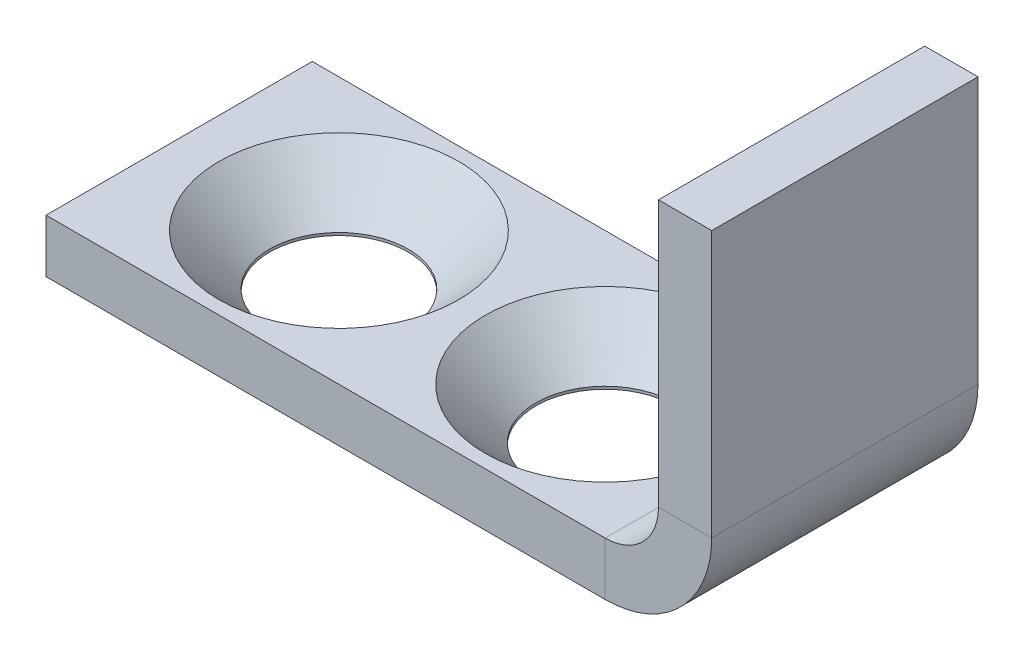
ISO-10303-21;
HEADER;
FILE_DESCRIPTION(('STEP AP214'),'2;1');
FILE_NAME('part.step','',(''),(''),'','','');
FILE_SCHEMA(('AUTOMOTIVE_DESIGN { 1 0 10303 214 1 1 1 1 }'));
ENDSEC;
DATA;
#1=APPLICATION_CONTEXT('core data for automotive mechanical design processes');
#2=APPLICATION_PROTOCOL_DEFINITION('international standard','automotive_design',2000,#1);
#3=PRODUCT_CONTEXT('',#1,'mechanical');
#4=PRODUCT('Part','Part','',(#3));
#5=PRODUCT_RELATED_PRODUCT_CATEGORY('part','',(#4));
#6=PRODUCT_DEFINITION_FORMATION('','',#4);
#7=PRODUCT_DEFINITION_CONTEXT('part definition',#1,'design');
#8=PRODUCT_DEFINITION('design','',#6,#7);
#9=PRODUCT_DEFINITION_SHAPE('','',#8);
#10=(LENGTH_UNIT() NAMED_UNIT(*) SI_UNIT(.MILLI.,.METRE.));
#11=(NAMED_UNIT(*) PLANE_ANGLE_UNIT() SI_UNIT($,.RADIAN.));
#12=(NAMED_UNIT(*) SI_UNIT($,.STERADIAN.) SOLID_ANGLE_UNIT());
#13=UNCERTAINTY_MEASURE_WITH_UNIT(LENGTH_MEASURE(1.E-05),#10,'distance_accuracy_value','');
#14=(GEOMETRIC_REPRESENTATION_CONTEXT(3) GLOBAL_UNCERTAINTY_ASSIGNED_CONTEXT((#13)) GLOBAL_UNIT_ASSIGNED_CONTEXT((#10,
#11,#12)) REPRESENTATION_CONTEXT('',''));
#15=CARTESIAN_POINT('',(0.,0.,0.));
#16=DIRECTION('',(0.,0.,1.));
#17=DIRECTION('',(1.,0.,0.));
#18=AXIS2_PLACEMENT_3D('',#15,#16,#17);
#19=CARTESIAN_POINT('',(0.,1.,5.));
#20=DIRECTION('',(0.,0.,1.));
#21=DIRECTION('',(1.,0.,0.));
#22=AXIS2_PLACEMENT_3D('',#19,#20,#21);
#23=PLANE('',#22);
#24=DIRECTION('',(1.,0.,0.));
#25=VECTOR('',#24,1.);
#26=CARTESIAN_POINT('',(0.,1.,5.));
#27=LINE('',#26,#25);
#28=CARTESIAN_POINT('',(0.,1.,5.));
#29=VERTEX_POINT('',#28);
#30=CARTESIAN_POINT('',(1.,1.,5.));
#31=VERTEX_POINT('',#30);
#32=EDGE_CURVE('E11',#29,#31,#27,.T.);
#33=ORIENTED_EDGE('',*,*,#32,.F.);
#34=CARTESIAN_POINT('',(-1.,1.,5.));
#35=DIRECTION('',(0.,0.,-1.));
#36=DIRECTION('',(-1.,0.,0.));
#37=AXIS2_PLACEMENT_3D('',#34,#35,#36);
#38=CIRCLE('',#37,1.);
#39=CARTESIAN_POINT('',(-1.,0.,5.));
#40=VERTEX_POINT('',#39);
#41=EDGE_CURVE('E144',#40,#29,#38,.F.);
#42=ORIENTED_EDGE('',*,*,#41,.F.);
#43=DIRECTION('',(0.,1.,0.));
#44=VECTOR('',#43,1.);
#45=CARTESIAN_POINT('',(-1.,-1.,5.));
#46=LINE('',#45,#44);
#47=CARTESIAN_POINT('',(-1.,-1.,5.));
#48=VERTEX_POINT('',#47);
#49=EDGE_CURVE('E51',#48,#40,#46,.T.);
#50=ORIENTED_EDGE('',*,*,#49,.F.);
#51=CARTESIAN_POINT('',(-1.,1.,5.));
#52=DIRECTION('',(0.,0.,1.));
#53=DIRECTION('',(1.,0.,0.));
#54=AXIS2_PLACEMENT_3D('',#51,#52,#53);
#55=CIRCLE('',#54,2.);
#56=EDGE_CURVE('E135',#48,#31,#55,.T.);
#57=ORIENTED_EDGE('',*,*,#56,.T.);
#58=EDGE_LOOP('',(#33,#42,#50,#57));
#59=FACE_BOUND('',#58,.T.);
#60=ADVANCED_FACE('F42',(#59),#23,.T.);
#61=CARTESIAN_POINT('',(-1.,-1.,5.));
#62=DIRECTION('',(0.,0.,1.));
#63=DIRECTION('',(1.,0.,0.));
#64=AXIS2_PLACEMENT_3D('',#61,#62,#63);
#65=PLANE('',#64);
#66=DIRECTION('',(0.,1.,0.));
#67=VECTOR('',#66,1.);
#68=CARTESIAN_POINT('',(0.,0.,5.));
#69=LINE('',#68,#67);
#70=CARTESIAN_POINT('',(0.,6.,5.));
#71=VERTEX_POINT('',#70);
#72=EDGE_CURVE('E214',#29,#71,#69,.T.);
#73=ORIENTED_EDGE('',*,*,#72,.F.);
#74=ORIENTED_EDGE('',*,*,#32,.T.);
#75=DIRECTION('',(0.,1.,0.));
#76=VECTOR('',#75,1.);
#77=CARTESIAN_POINT('',(1.,0.,5.));
#78=LINE('',#77,#76);
#79=CARTESIAN_POINT('',(1.,6.,5.));
#80=VERTEX_POINT('',#79);
#81=EDGE_CURVE('E99',#31,#80,#78,.T.);
#82=ORIENTED_EDGE('',*,*,#81,.T.);
#83=DIRECTION('',(1.,0.,0.));
#84=VECTOR('',#83,1.);
#85=CARTESIAN_POINT('',(0.,6.,5.));
#86=LINE('',#85,#84);
#87=EDGE_CURVE('E422',#71,#80,#86,.T.);
#88=ORIENTED_EDGE('',*,*,#87,.F.);
#89=EDGE_LOOP('',(#73,#74,#82,#88));
#90=FACE_BOUND('',#89,.T.);
#91=ADVANCED_FACE('F222',(#90),#65,.T.);
#92=CARTESIAN_POINT('',(-1.,0.,0.));
#93=DIRECTION('',(0.,0.,-1.));
#94=DIRECTION('',(-1.,0.,0.));
#95=AXIS2_PLACEMENT_3D('',#92,#93,#94);
#96=PLANE('',#95);
#97=DIRECTION('',(0.,-1.,0.));
#98=VECTOR('',#97,1.);
#99=CARTESIAN_POINT('',(-1.,0.,0.));
#100=LINE('',#99,#98);
#101=CARTESIAN_POINT('',(-1.,0.,0.));
#102=VERTEX_POINT('',#101);
#103=CARTESIAN_POINT('',(-1.,-1.,0.));
#104=VERTEX_POINT('',#103);
#105=EDGE_CURVE('E86',#102,#104,#100,.T.);
#106=ORIENTED_EDGE('',*,*,#105,.F.);
#107=CARTESIAN_POINT('',(-1.,1.,0.));
#108=DIRECTION('',(0.,0.,-1.));
#109=DIRECTION('',(-1.,0.,0.));
#110=AXIS2_PLACEMENT_3D('',#107,#108,#109);
#111=CIRCLE('',#110,1.);
#112=CARTESIAN_POINT('',(0.,1.,0.));
#113=VERTEX_POINT('',#112);
#114=EDGE_CURVE('E164',#102,#113,#111,.F.);
#115=ORIENTED_EDGE('',*,*,#114,.T.);
#116=DIRECTION('',(-1.,0.,0.));
#117=VECTOR('',#116,1.);
#118=CARTESIAN_POINT('',(1.,1.,0.));
#119=LINE('',#118,#117);
#120=CARTESIAN_POINT('',(1.,1.,0.));
#121=VERTEX_POINT('',#120);
#122=EDGE_CURVE('E93',#121,#113,#119,.T.);
#123=ORIENTED_EDGE('',*,*,#122,.F.);
#124=CARTESIAN_POINT('',(-1.,1.,0.));
#125=DIRECTION('',(0.,0.,1.));
#126=DIRECTION('',(1.,0.,0.));
#127=AXIS2_PLACEMENT_3D('',#124,#125,#126);
#128=CIRCLE('',#127,2.);
#129=EDGE_CURVE('E175',#104,#121,#128,.T.);
#130=ORIENTED_EDGE('',*,*,#129,.F.);
#131=EDGE_LOOP('',(#106,#115,#123,#130));
#132=FACE_BOUND('',#131,.T.);
#133=ADVANCED_FACE('F220',(#132),#96,.T.);
#134=CARTESIAN_POINT('',(1.,1.,0.));
#135=DIRECTION('',(0.,0.,-1.));
#136=DIRECTION('',(-1.,0.,0.));
#137=AXIS2_PLACEMENT_3D('',#134,#135,#136);
#138=PLANE('',#137);
#139=DIRECTION('',(1.,0.,0.));
#140=VECTOR('',#139,1.);
#141=CARTESIAN_POINT('',(-11.5,0.,0.));
#142=LINE('',#141,#140);
#143=CARTESIAN_POINT('',(-11.5,0.,0.));
#144=VERTEX_POINT('',#143);
#145=EDGE_CURVE('E167',#144,#102,#142,.T.);
#146=ORIENTED_EDGE('',*,*,#145,.T.);
#147=ORIENTED_EDGE('',*,*,#105,.T.);
#148=DIRECTION('',(1.,0.,0.));
#149=VECTOR('',#148,1.);
#150=CARTESIAN_POINT('',(-11.5,-1.,0.));
#151=LINE('',#150,#149);
#152=CARTESIAN_POINT('',(-11.5,-1.,0.));
#153=VERTEX_POINT('',#152);
#154=EDGE_CURVE('E172',#153,#104,#151,.T.);
#155=ORIENTED_EDGE('',*,*,#154,.F.);
#156=DIRECTION('',(0.,1.,0.));
#157=VECTOR('',#156,1.);
#158=CARTESIAN_POINT('',(-11.5,-1.,0.));
#159=LINE('',#158,#157);
#160=EDGE_CURVE('E121',#153,#144,#159,.T.);
#161=ORIENTED_EDGE('',*,*,#160,.T.);
#162=EDGE_LOOP('',(#146,#147,#155,#161));
#163=FACE_BOUND('',#162,.T.);
#164=ADVANCED_FACE('F216',(#163),#138,.T.);
#165=CARTESIAN_POINT('',(1.,0.,5.));
#166=DIRECTION('',(-1.,0.,0.));
#167=DIRECTION('',(0.,0.,1.));
#168=AXIS2_PLACEMENT_3D('',#165,#166,#167);
#169=PLANE('',#168);
#170=DIRECTION('',(0.,1.,0.));
#171=VECTOR('',#170,1.);
#172=CARTESIAN_POINT('',(1.,0.,0.));
#173=LINE('',#172,#171);
#174=CARTESIAN_POINT('',(1.,6.,0.));
#175=VERTEX_POINT('',#174);
#176=EDGE_CURVE('E151',#121,#175,#173,.T.);
#177=ORIENTED_EDGE('',*,*,#176,.T.);
#178=DIRECTION('',(0.,0.,-1.));
#179=VECTOR('',#178,1.);
#180=CARTESIAN_POINT('',(1.,6.,5.));
#181=LINE('',#180,#179);
#182=EDGE_CURVE('E196',#80,#175,#181,.T.);
#183=ORIENTED_EDGE('',*,*,#182,.F.);
#184=ORIENTED_EDGE('',*,*,#81,.F.);
#185=DIRECTION('',(0.,0.,-1.));
#186=VECTOR('',#185,1.);
#187=CARTESIAN_POINT('',(1.,1.,5.));
#188=LINE('',#187,#186);
#189=EDGE_CURVE('E150',#31,#121,#188,.T.);
#190=ORIENTED_EDGE('',*,*,#189,.T.);
#191=EDGE_LOOP('',(#177,#183,#184,#190));
#192=FACE_BOUND('',#191,.T.);
#193=ADVANCED_FACE('F228',(#192),#169,.F.);
#194=CARTESIAN_POINT('',(0.,6.,5.));
#195=DIRECTION('',(0.,1.,0.));
#196=DIRECTION('',(0.,0.,1.));
#197=AXIS2_PLACEMENT_3D('',#194,#195,#196);
#198=PLANE('',#197);
#199=DIRECTION('',(1.,0.,0.));
#200=VECTOR('',#199,1.);
#201=CARTESIAN_POINT('',(0.,6.,0.));
#202=LINE('',#201,#200);
#203=CARTESIAN_POINT('',(0.,6.,0.));
#204=VERTEX_POINT('',#203);
#205=EDGE_CURVE('E155',#204,#175,#202,.T.);
#206=ORIENTED_EDGE('',*,*,#205,.F.);
#207=DIRECTION('',(0.,0.,-1.));
#208=VECTOR('',#207,1.);
#209=CARTESIAN_POINT('',(0.,6.,5.));
#210=LINE('',#209,#208);
#211=EDGE_CURVE('E193',#71,#204,#210,.T.);
#212=ORIENTED_EDGE('',*,*,#211,.F.);
#213=ORIENTED_EDGE('',*,*,#87,.T.);
#214=ORIENTED_EDGE('',*,*,#182,.T.);
#215=EDGE_LOOP('',(#206,#212,#213,#214));
#216=FACE_BOUND('',#215,.T.);
#217=ADVANCED_FACE('F259',(#216),#198,.T.);
#218=CARTESIAN_POINT('',(0.,0.,5.));
#219=DIRECTION('',(-1.,0.,0.));
#220=DIRECTION('',(0.,0.,1.));
#221=AXIS2_PLACEMENT_3D('',#218,#219,#220);
#222=PLANE('',#221);
#223=DIRECTION('',(0.,1.,0.));
#224=VECTOR('',#223,1.);
#225=CARTESIAN_POINT('',(0.,0.,0.));
#226=LINE('',#225,#224);
#227=EDGE_CURVE('E160',#113,#204,#226,.T.);
#228=ORIENTED_EDGE('',*,*,#227,.F.);
#229=DIRECTION('',(0.,0.,-1.));
#230=VECTOR('',#229,1.);
#231=CARTESIAN_POINT('',(0.,1.,5.));
#232=LINE('',#231,#230);
#233=EDGE_CURVE('E189',#29,#113,#232,.T.);
#234=ORIENTED_EDGE('',*,*,#233,.F.);
#235=ORIENTED_EDGE('',*,*,#72,.T.);
#236=ORIENTED_EDGE('',*,*,#211,.T.);
#237=EDGE_LOOP('',(#228,#234,#235,#236));
#238=FACE_BOUND('',#237,.T.);
#239=ADVANCED_FACE('F270',(#238),#222,.T.);
#240=CARTESIAN_POINT('',(-1.,1.,5.));
#241=DIRECTION('',(0.,0.,-1.));
#242=DIRECTION('',(-1.,0.,0.));
#243=AXIS2_PLACEMENT_3D('',#240,#241,#242);
#244=CYLINDRICAL_SURFACE('',#243,1.);
#245=ORIENTED_EDGE('',*,*,#114,.F.);
#246=DIRECTION('',(0.,0.,-1.));
#247=VECTOR('',#246,1.);
#248=CARTESIAN_POINT('',(-1.,0.,5.));
#249=LINE('',#248,#247);
#250=EDGE_CURVE('E185',#40,#102,#249,.T.);
#251=ORIENTED_EDGE('',*,*,#250,.F.);
#252=ORIENTED_EDGE('',*,*,#41,.T.);
#253=ORIENTED_EDGE('',*,*,#233,.T.);
#254=EDGE_LOOP('',(#245,#251,#252,#253));
#255=FACE_BOUND('',#254,.T.);
#256=ADVANCED_FACE('F209',(#255),#244,.F.);
#257=CARTESIAN_POINT('',(-11.5,0.,5.));
#258=DIRECTION('',(0.,1.,0.));
#259=DIRECTION('',(0.,0.,1.));
#260=AXIS2_PLACEMENT_3D('',#257,#258,#259);
#261=PLANE('',#260);
#262=CARTESIAN_POINT('',(-8.5,0.,2.5));
#263=DIRECTION('',(0.,1.,0.));
#264=DIRECTION('',(0.,0.,1.));
#265=AXIS2_PLACEMENT_3D('',#262,#263,#264);
#266=CIRCLE('',#265,2.25);
#267=CARTESIAN_POINT('',(-8.5,0.,4.75));
#268=VERTEX_POINT('',#267);
#269=EDGE_CURVE('E399',#268,#268,#266,.T.);
#270=ORIENTED_EDGE('',*,*,#269,.F.);
#271=EDGE_LOOP('',(#270));
#272=FACE_BOUND('',#271,.T.);
#273=CARTESIAN_POINT('',(-3.5,0.,2.5));
#274=DIRECTION('',(0.,1.,0.));
#275=DIRECTION('',(0.,0.,1.));
#276=AXIS2_PLACEMENT_3D('',#273,#274,#275);
#277=CIRCLE('',#276,2.25);
#278=CARTESIAN_POINT('',(-3.5,0.,4.75));
#279=VERTEX_POINT('',#278);
#280=EDGE_CURVE('E409',#279,#279,#277,.T.);
#281=ORIENTED_EDGE('',*,*,#280,.F.);
#282=EDGE_LOOP('',(#281));
#283=FACE_BOUND('',#282,.T.);
#284=ORIENTED_EDGE('',*,*,#145,.F.);
#285=DIRECTION('',(0.,0.,-1.));
#286=VECTOR('',#285,1.);
#287=CARTESIAN_POINT('',(-11.5,0.,5.));
#288=LINE('',#287,#286);
#289=CARTESIAN_POINT('',(-11.5,0.,5.));
#290=VERTEX_POINT('',#289);
#291=EDGE_CURVE('E124',#290,#144,#288,.T.);
#292=ORIENTED_EDGE('',*,*,#291,.F.);
#293=DIRECTION('',(1.,0.,0.));
#294=VECTOR('',#293,1.);
#295=CARTESIAN_POINT('',(-11.5,0.,5.));
#296=LINE('',#295,#294);
#297=EDGE_CURVE('E140',#290,#40,#296,.T.);
#298=ORIENTED_EDGE('',*,*,#297,.T.);
#299=ORIENTED_EDGE('',*,*,#250,.T.);
#300=EDGE_LOOP('',(#284,#292,#298,#299));
#301=FACE_BOUND('',#300,.T.);
#302=ADVANCED_FACE('F215',(#272,#283,#301),#261,.T.);
#303=CARTESIAN_POINT('',(-11.5,-1.,5.));
#304=DIRECTION('',(-1.,0.,0.));
#305=DIRECTION('',(0.,0.,1.));
#306=AXIS2_PLACEMENT_3D('',#303,#304,#305);
#307=PLANE('',#306);
#308=ORIENTED_EDGE('',*,*,#160,.F.);
#309=DIRECTION('',(0.,0.,-1.));
#310=VECTOR('',#309,1.);
#311=CARTESIAN_POINT('',(-11.5,-1.,5.));
#312=LINE('',#311,#310);
#313=CARTESIAN_POINT('',(-11.5,-1.,5.));
#314=VERTEX_POINT('',#313);
#315=EDGE_CURVE('E115',#314,#153,#312,.T.);
#316=ORIENTED_EDGE('',*,*,#315,.F.);
#317=DIRECTION('',(0.,1.,0.));
#318=VECTOR('',#317,1.);
#319=CARTESIAN_POINT('',(-11.5,-1.,5.));
#320=LINE('',#319,#318);
#321=EDGE_CURVE('E119',#314,#290,#320,.T.);
#322=ORIENTED_EDGE('',*,*,#321,.T.);
#323=ORIENTED_EDGE('',*,*,#291,.T.);
#324=EDGE_LOOP('',(#308,#316,#322,#323));
#325=FACE_BOUND('',#324,.T.);
#326=ADVANCED_FACE('F117',(#325),#307,.T.);
#327=CARTESIAN_POINT('',(-11.5,-1.,5.));
#328=DIRECTION('',(0.,1.,0.));
#329=DIRECTION('',(0.,0.,1.));
#330=AXIS2_PLACEMENT_3D('',#327,#328,#329);
#331=PLANE('',#330);
#332=CARTESIAN_POINT('',(-8.5,-1.,2.5));
#333=DIRECTION('',(0.,1.,0.));
#334=DIRECTION('',(0.,0.,1.));
#335=AXIS2_PLACEMENT_3D('',#332,#333,#334);
#336=CIRCLE('',#335,1.3);
#337=CARTESIAN_POINT('',(-8.5,-1.,3.8));
#338=VERTEX_POINT('',#337);
#339=EDGE_CURVE('E403',#338,#338,#336,.T.);
#340=ORIENTED_EDGE('',*,*,#339,.T.);
#341=EDGE_LOOP('',(#340));
#342=FACE_BOUND('',#341,.T.);
#343=CARTESIAN_POINT('',(-3.5,-1.,2.5));
#344=DIRECTION('',(0.,1.,0.));
#345=DIRECTION('',(0.,0.,1.));
#346=AXIS2_PLACEMENT_3D('',#343,#344,#345);
#347=CIRCLE('',#346,1.3);
#348=CARTESIAN_POINT('',(-3.5,-1.,3.8));
#349=VERTEX_POINT('',#348);
#350=EDGE_CURVE('E156',#349,#349,#347,.T.);
#351=ORIENTED_EDGE('',*,*,#350,.T.);
#352=EDGE_LOOP('',(#351));
#353=FACE_BOUND('',#352,.T.);
#354=ORIENTED_EDGE('',*,*,#154,.T.);
#355=DIRECTION('',(0.,0.,-1.));
#356=VECTOR('',#355,1.);
#357=CARTESIAN_POINT('',(-1.,-1.,5.));
#358=LINE('',#357,#356);
#359=EDGE_CURVE('E125',#48,#104,#358,.T.);
#360=ORIENTED_EDGE('',*,*,#359,.F.);
#361=DIRECTION('',(1.,0.,0.));
#362=VECTOR('',#361,1.);
#363=CARTESIAN_POINT('',(-11.5,-1.,5.));
#364=LINE('',#363,#362);
#365=EDGE_CURVE('E129',#314,#48,#364,.T.);
#366=ORIENTED_EDGE('',*,*,#365,.F.);
#367=ORIENTED_EDGE('',*,*,#315,.T.);
#368=EDGE_LOOP('',(#354,#360,#366,#367));
#369=FACE_BOUND('',#368,.T.);
#370=ADVANCED_FACE('F130',(#342,#353,#369),#331,.F.);
#371=CARTESIAN_POINT('',(-1.,1.,5.));
#372=DIRECTION('',(0.,0.,-1.));
#373=DIRECTION('',(-1.,0.,0.));
#374=AXIS2_PLACEMENT_3D('',#371,#372,#373);
#375=CYLINDRICAL_SURFACE('',#374,2.);
#376=ORIENTED_EDGE('',*,*,#129,.T.);
#377=ORIENTED_EDGE('',*,*,#189,.F.);
#378=ORIENTED_EDGE('',*,*,#56,.F.);
#379=ORIENTED_EDGE('',*,*,#359,.T.);
#380=EDGE_LOOP('',(#376,#377,#378,#379));
#381=FACE_BOUND('',#380,.T.);
#382=ADVANCED_FACE('F218',(#381),#375,.T.);
#383=CARTESIAN_POINT('',(-1.,1.,5.));
#384=DIRECTION('',(0.,0.,-1.));
#385=DIRECTION('',(-1.,0.,0.));
#386=AXIS2_PLACEMENT_3D('',#383,#384,#385);
#387=PLANE('',#386);
#388=ORIENTED_EDGE('',*,*,#365,.T.);
#389=ORIENTED_EDGE('',*,*,#49,.T.);
#390=ORIENTED_EDGE('',*,*,#297,.F.);
#391=ORIENTED_EDGE('',*,*,#321,.F.);
#392=EDGE_LOOP('',(#388,#389,#390,#391));
#393=FACE_BOUND('',#392,.T.);
#394=ADVANCED_FACE('F138',(#393),#387,.F.);
#395=CARTESIAN_POINT('',(-1.,1.,0.));
#396=DIRECTION('',(0.,0.,-1.));
#397=DIRECTION('',(-1.,0.,0.));
#398=AXIS2_PLACEMENT_3D('',#395,#396,#397);
#399=PLANE('',#398);
#400=ORIENTED_EDGE('',*,*,#176,.F.);
#401=ORIENTED_EDGE('',*,*,#122,.T.);
#402=ORIENTED_EDGE('',*,*,#227,.T.);
#403=ORIENTED_EDGE('',*,*,#205,.T.);
#404=EDGE_LOOP('',(#400,#401,#402,#403));
#405=FACE_BOUND('',#404,.T.);
#406=ADVANCED_FACE('F322',(#405),#399,.T.);
#407=CARTESIAN_POINT('',(-3.5,0.,2.5));
#408=DIRECTION('',(0.,1.,0.));
#409=DIRECTION('',(0.,0.,1.));
#410=AXIS2_PLACEMENT_3D('',#407,#408,#409);
#411=CYLINDRICAL_SURFACE('',#410,1.3);
#412=ORIENTED_EDGE('',*,*,#350,.F.);
#413=EDGE_LOOP('',(#412));
#414=FACE_BOUND('',#413,.T.);
#415=CARTESIAN_POINT('',(-3.5,-0.95,2.5));
#416=DIRECTION('',(0.,1.,0.));
#417=DIRECTION('',(0.,0.,1.));
#418=AXIS2_PLACEMENT_3D('',#415,#416,#417);
#419=CIRCLE('',#418,1.3);
#420=CARTESIAN_POINT('',(-3.5,-0.95,3.8));
#421=VERTEX_POINT('',#420);
#422=EDGE_CURVE('E413',#421,#421,#419,.T.);
#423=ORIENTED_EDGE('',*,*,#422,.T.);
#424=EDGE_LOOP('',(#423));
#425=FACE_BOUND('',#424,.T.);
#426=ADVANCED_FACE('F332',(#414,#425),#411,.F.);
#427=CARTESIAN_POINT('',(-3.5,0.,2.5));
#428=DIRECTION('',(0.,1.,0.));
#429=DIRECTION('',(0.,0.,1.));
#430=AXIS2_PLACEMENT_3D('',#427,#428,#429);
#431=CONICAL_SURFACE('',#430,2.25,0.785398163397448);
#432=ORIENTED_EDGE('',*,*,#422,.F.);
#433=EDGE_LOOP('',(#432));
#434=FACE_BOUND('',#433,.T.);
#435=ORIENTED_EDGE('',*,*,#280,.T.);
#436=EDGE_LOOP('',(#435));
#437=FACE_BOUND('',#436,.T.);
#438=ADVANCED_FACE('F359',(#434,#437),#431,.F.);
#439=CARTESIAN_POINT('',(-8.5,0.,2.5));
#440=DIRECTION('',(0.,1.,0.));
#441=DIRECTION('',(0.,0.,1.));
#442=AXIS2_PLACEMENT_3D('',#439,#440,#441);
#443=CYLINDRICAL_SURFACE('',#442,1.3);
#444=ORIENTED_EDGE('',*,*,#339,.F.);
#445=EDGE_LOOP('',(#444));
#446=FACE_BOUND('',#445,.T.);
#447=CARTESIAN_POINT('',(-8.5,-0.95,2.5));
#448=DIRECTION('',(0.,1.,0.));
#449=DIRECTION('',(0.,0.,1.));
#450=AXIS2_PLACEMENT_3D('',#447,#448,#449);
#451=CIRCLE('',#450,1.3);
#452=CARTESIAN_POINT('',(-8.5,-0.95,3.8));
#453=VERTEX_POINT('',#452);
#454=EDGE_CURVE('E396',#453,#453,#451,.T.);
#455=ORIENTED_EDGE('',*,*,#454,.T.);
#456=EDGE_LOOP('',(#455));
#457=FACE_BOUND('',#456,.T.);
#458=ADVANCED_FACE('F369',(#446,#457),#443,.F.);
#459=CARTESIAN_POINT('',(-8.5,0.,2.5));
#460=DIRECTION('',(0.,1.,0.));
#461=DIRECTION('',(0.,0.,1.));
#462=AXIS2_PLACEMENT_3D('',#459,#460,#461);
#463=CONICAL_SURFACE('',#462,2.25,0.785398163397448);
#464=ORIENTED_EDGE('',*,*,#454,.F.);
#465=EDGE_LOOP('',(#464));
#466=FACE_BOUND('',#465,.T.);
#467=ORIENTED_EDGE('',*,*,#269,.T.);
#468=EDGE_LOOP('',(#467));
#469=FACE_BOUND('',#468,.T.);
#470=ADVANCED_FACE('F379',(#466,#469),#463,.F.);
#471=CLOSED_SHELL('',(#60,#91,#133,#164,#193,#217,#239,#256,#302,#326,#370,#382,#394,#406,#426,
#438,#458,#470));
#472=MANIFOLD_SOLID_BREP('B2',#471);
#473=ADVANCED_BREP_SHAPE_REPRESENTATION('',(#18,#472),#14);
#474=SHAPE_DEFINITION_REPRESENTATION(#9,#473);
ENDSEC;
END-ISO-10303-21;
